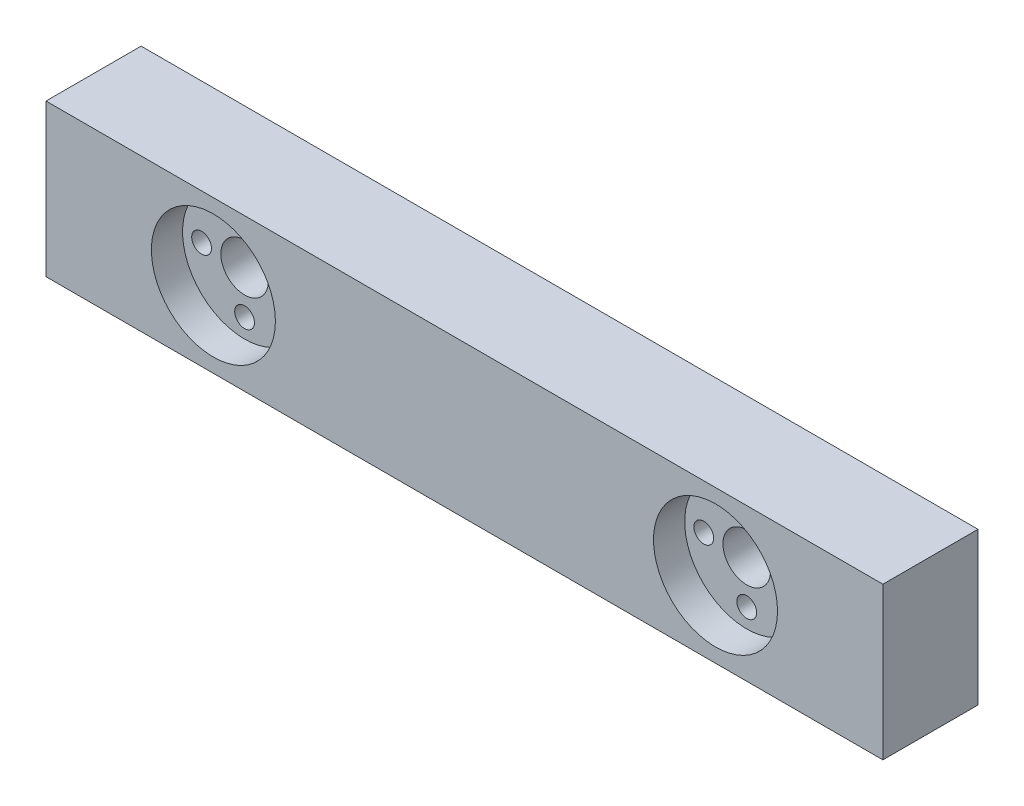
ISO-10303-21;
HEADER;
FILE_DESCRIPTION(('STEP AP214'),'2;1');
FILE_NAME('part.step','',(''),(''),'','','');
FILE_SCHEMA(('AUTOMOTIVE_DESIGN { 1 0 10303 214 1 1 1 1 }'));
ENDSEC;
DATA;
#1=APPLICATION_CONTEXT('core data for automotive mechanical design processes');
#2=APPLICATION_PROTOCOL_DEFINITION('international standard','automotive_design',2000,#1);
#3=PRODUCT_CONTEXT('',#1,'mechanical');
#4=PRODUCT('Part','Part','',(#3));
#5=PRODUCT_RELATED_PRODUCT_CATEGORY('part','',(#4));
#6=PRODUCT_DEFINITION_FORMATION('','',#4);
#7=PRODUCT_DEFINITION_CONTEXT('part definition',#1,'design');
#8=PRODUCT_DEFINITION('design','',#6,#7);
#9=PRODUCT_DEFINITION_SHAPE('','',#8);
#10=(LENGTH_UNIT() NAMED_UNIT(*) SI_UNIT(.MILLI.,.METRE.));
#11=(NAMED_UNIT(*) PLANE_ANGLE_UNIT() SI_UNIT($,.RADIAN.));
#12=(NAMED_UNIT(*) SI_UNIT($,.STERADIAN.) SOLID_ANGLE_UNIT());
#13=UNCERTAINTY_MEASURE_WITH_UNIT(LENGTH_MEASURE(1.E-05),#10,'distance_accuracy_value','');
#14=(GEOMETRIC_REPRESENTATION_CONTEXT(3) GLOBAL_UNCERTAINTY_ASSIGNED_CONTEXT((#13)) GLOBAL_UNIT_ASSIGNED_CONTEXT((#10,
#11,#12)) REPRESENTATION_CONTEXT('',''));
#15=CARTESIAN_POINT('',(0.,0.,0.));
#16=DIRECTION('',(0.,0.,1.));
#17=DIRECTION('',(1.,0.,0.));
#18=AXIS2_PLACEMENT_3D('',#15,#16,#17);
#19=CARTESIAN_POINT('',(5362.5,975.,-661.75019529546));
#20=DIRECTION('',(-1.,0.,0.));
#21=DIRECTION('',(0.,0.,1.));
#22=AXIS2_PLACEMENT_3D('',#19,#20,#21);
#23=PLANE('',#22);
#24=DIRECTION('',(0.,-1.,0.));
#25=VECTOR('',#24,1.);
#26=CARTESIAN_POINT('',(5362.5,975.,-630.50019529546));
#27=LINE('',#26,#25);
#28=CARTESIAN_POINT('',(5362.5,1025.,-630.50019529546));
#29=VERTEX_POINT('',#28);
#30=CARTESIAN_POINT('',(5362.5,975.,-630.50019529546));
#31=VERTEX_POINT('',#30);
#32=EDGE_CURVE('E118',#29,#31,#27,.T.);
#33=ORIENTED_EDGE('',*,*,#32,.F.);
#34=DIRECTION('',(0.,0.,1.));
#35=VECTOR('',#34,1.);
#36=CARTESIAN_POINT('',(5362.5,1025.,-661.75019529546));
#37=LINE('',#36,#35);
#38=CARTESIAN_POINT('',(5362.5,1025.,-661.75019529546));
#39=VERTEX_POINT('',#38);
#40=EDGE_CURVE('E11',#39,#29,#37,.T.);
#41=ORIENTED_EDGE('',*,*,#40,.F.);
#42=DIRECTION('',(0.,-1.,0.));
#43=VECTOR('',#42,1.);
#44=CARTESIAN_POINT('',(5362.5,975.,-661.75019529546));
#45=LINE('',#44,#43);
#46=CARTESIAN_POINT('',(5362.5,975.,-661.75019529546));
#47=VERTEX_POINT('',#46);
#48=EDGE_CURVE('E109',#39,#47,#45,.T.);
#49=ORIENTED_EDGE('',*,*,#48,.T.);
#50=DIRECTION('',(0.,0.,1.));
#51=VECTOR('',#50,1.);
#52=CARTESIAN_POINT('',(5362.5,975.,-661.75019529546));
#53=LINE('',#52,#51);
#54=EDGE_CURVE('E89',#47,#31,#53,.T.);
#55=ORIENTED_EDGE('',*,*,#54,.T.);
#56=EDGE_LOOP('',(#33,#41,#49,#55));
#57=FACE_BOUND('',#56,.T.);
#58=ADVANCED_FACE('F45',(#57),#23,.T.);
#59=CARTESIAN_POINT('',(5362.5,1025.,-661.75019529546));
#60=DIRECTION('',(0.,1.,0.));
#61=DIRECTION('',(0.,0.,1.));
#62=AXIS2_PLACEMENT_3D('',#59,#60,#61);
#63=PLANE('',#62);
#64=DIRECTION('',(-1.,0.,0.));
#65=VECTOR('',#64,1.);
#66=CARTESIAN_POINT('',(5362.5,1025.,-630.50019529546));
#67=LINE('',#66,#65);
#68=CARTESIAN_POINT('',(5637.5,1025.,-630.50019529546));
#69=VERTEX_POINT('',#68);
#70=EDGE_CURVE('E112',#69,#29,#67,.T.);
#71=ORIENTED_EDGE('',*,*,#70,.F.);
#72=DIRECTION('',(0.,0.,1.));
#73=VECTOR('',#72,1.);
#74=CARTESIAN_POINT('',(5637.5,1025.,-661.75019529546));
#75=LINE('',#74,#73);
#76=CARTESIAN_POINT('',(5637.5,1025.,-661.75019529546));
#77=VERTEX_POINT('',#76);
#78=EDGE_CURVE('E55',#77,#69,#75,.T.);
#79=ORIENTED_EDGE('',*,*,#78,.F.);
#80=DIRECTION('',(-1.,0.,0.));
#81=VECTOR('',#80,1.);
#82=CARTESIAN_POINT('',(5362.5,1025.,-661.75019529546));
#83=LINE('',#82,#81);
#84=EDGE_CURVE('E104',#77,#39,#83,.T.);
#85=ORIENTED_EDGE('',*,*,#84,.T.);
#86=ORIENTED_EDGE('',*,*,#40,.T.);
#87=EDGE_LOOP('',(#71,#79,#85,#86));
#88=FACE_BOUND('',#87,.T.);
#89=ADVANCED_FACE('F226',(#88),#63,.T.);
#90=CARTESIAN_POINT('',(5637.5,975.,-661.75019529546));
#91=DIRECTION('',(1.,0.,0.));
#92=DIRECTION('',(0.,0.,-1.));
#93=AXIS2_PLACEMENT_3D('',#90,#91,#92);
#94=PLANE('',#93);
#95=DIRECTION('',(0.,1.,0.));
#96=VECTOR('',#95,1.);
#97=CARTESIAN_POINT('',(5637.5,975.,-630.50019529546));
#98=LINE('',#97,#96);
#99=CARTESIAN_POINT('',(5637.5,975.,-630.50019529546));
#100=VERTEX_POINT('',#99);
#101=EDGE_CURVE('E97',#100,#69,#98,.T.);
#102=ORIENTED_EDGE('',*,*,#101,.F.);
#103=DIRECTION('',(0.,0.,1.));
#104=VECTOR('',#103,1.);
#105=CARTESIAN_POINT('',(5637.5,975.,-661.75019529546));
#106=LINE('',#105,#104);
#107=CARTESIAN_POINT('',(5637.5,975.,-661.75019529546));
#108=VERTEX_POINT('',#107);
#109=EDGE_CURVE('E92',#108,#100,#106,.T.);
#110=ORIENTED_EDGE('',*,*,#109,.F.);
#111=DIRECTION('',(0.,1.,0.));
#112=VECTOR('',#111,1.);
#113=CARTESIAN_POINT('',(5637.5,975.,-661.75019529546));
#114=LINE('',#113,#112);
#115=EDGE_CURVE('E95',#108,#77,#114,.T.);
#116=ORIENTED_EDGE('',*,*,#115,.T.);
#117=ORIENTED_EDGE('',*,*,#78,.T.);
#118=EDGE_LOOP('',(#102,#110,#116,#117));
#119=FACE_BOUND('',#118,.T.);
#120=ADVANCED_FACE('F94',(#119),#94,.T.);
#121=CARTESIAN_POINT('',(5362.5,975.,-661.75019529546));
#122=DIRECTION('',(0.,-1.,0.));
#123=DIRECTION('',(0.,0.,-1.));
#124=AXIS2_PLACEMENT_3D('',#121,#122,#123);
#125=PLANE('',#124);
#126=DIRECTION('',(1.,0.,0.));
#127=VECTOR('',#126,1.);
#128=CARTESIAN_POINT('',(5362.5,975.,-630.50019529546));
#129=LINE('',#128,#127);
#130=EDGE_CURVE('E122',#31,#100,#129,.T.);
#131=ORIENTED_EDGE('',*,*,#130,.F.);
#132=ORIENTED_EDGE('',*,*,#54,.F.);
#133=DIRECTION('',(1.,0.,0.));
#134=VECTOR('',#133,1.);
#135=CARTESIAN_POINT('',(5362.5,975.,-661.75019529546));
#136=LINE('',#135,#134);
#137=EDGE_CURVE('E103',#47,#108,#136,.T.);
#138=ORIENTED_EDGE('',*,*,#137,.T.);
#139=ORIENTED_EDGE('',*,*,#109,.T.);
#140=EDGE_LOOP('',(#131,#132,#138,#139));
#141=FACE_BOUND('',#140,.T.);
#142=ADVANCED_FACE('F107',(#141),#125,.T.);
#143=CARTESIAN_POINT('',(5362.5,975.,-661.75019529546));
#144=DIRECTION('',(0.,0.,-1.));
#145=DIRECTION('',(-1.,0.,0.));
#146=AXIS2_PLACEMENT_3D('',#143,#144,#145);
#147=PLANE('',#146);
#148=CARTESIAN_POINT('',(5582.5,985.875,-661.75019529546));
#149=DIRECTION('',(0.,0.,1.));
#150=DIRECTION('',(1.,0.,0.));
#151=AXIS2_PLACEMENT_3D('',#148,#149,#150);
#152=CIRCLE('',#151,3.25000000000004);
#153=CARTESIAN_POINT('',(5585.75,985.875,-661.75019529546));
#154=VERTEX_POINT('',#153);
#155=EDGE_CURVE('E168',#154,#154,#152,.T.);
#156=ORIENTED_EDGE('',*,*,#155,.T.);
#157=EDGE_LOOP('',(#156));
#158=FACE_BOUND('',#157,.T.);
#159=CARTESIAN_POINT('',(5568.375,1000.,-661.75019529546));
#160=DIRECTION('',(0.,0.,1.));
#161=DIRECTION('',(1.,0.,0.));
#162=AXIS2_PLACEMENT_3D('',#159,#160,#161);
#163=CIRCLE('',#162,3.25000000000004);
#164=CARTESIAN_POINT('',(5571.625,1000.,-661.75019529546));
#165=VERTEX_POINT('',#164);
#166=EDGE_CURVE('E298',#165,#165,#163,.T.);
#167=ORIENTED_EDGE('',*,*,#166,.T.);
#168=EDGE_LOOP('',(#167));
#169=FACE_BOUND('',#168,.T.);
#170=CARTESIAN_POINT('',(5582.5,1014.125,-661.75019529546));
#171=DIRECTION('',(0.,0.,1.));
#172=DIRECTION('',(1.,0.,0.));
#173=AXIS2_PLACEMENT_3D('',#170,#171,#172);
#174=CIRCLE('',#173,3.25000000000004);
#175=CARTESIAN_POINT('',(5585.75,1014.125,-661.75019529546));
#176=VERTEX_POINT('',#175);
#177=EDGE_CURVE('E302',#176,#176,#174,.T.);
#178=ORIENTED_EDGE('',*,*,#177,.T.);
#179=EDGE_LOOP('',(#178));
#180=FACE_BOUND('',#179,.T.);
#181=CARTESIAN_POINT('',(5596.625,1000.,-661.75019529546));
#182=DIRECTION('',(0.,0.,1.));
#183=DIRECTION('',(1.,0.,0.));
#184=AXIS2_PLACEMENT_3D('',#181,#182,#183);
#185=CIRCLE('',#184,3.25000000000003);
#186=CARTESIAN_POINT('',(5599.875,1000.,-661.75019529546));
#187=VERTEX_POINT('',#186);
#188=EDGE_CURVE('E308',#187,#187,#185,.T.);
#189=ORIENTED_EDGE('',*,*,#188,.T.);
#190=EDGE_LOOP('',(#189));
#191=FACE_BOUND('',#190,.T.);
#192=CARTESIAN_POINT('',(5417.5,985.875,-661.75019529546));
#193=DIRECTION('',(0.,0.,1.));
#194=DIRECTION('',(1.,0.,0.));
#195=AXIS2_PLACEMENT_3D('',#192,#193,#194);
#196=CIRCLE('',#195,3.25);
#197=CARTESIAN_POINT('',(5420.75,985.875,-661.75019529546));
#198=VERTEX_POINT('',#197);
#199=EDGE_CURVE('E150',#198,#198,#196,.T.);
#200=ORIENTED_EDGE('',*,*,#199,.T.);
#201=EDGE_LOOP('',(#200));
#202=FACE_BOUND('',#201,.T.);
#203=CARTESIAN_POINT('',(5403.375,1000.,-661.75019529546));
#204=DIRECTION('',(0.,0.,1.));
#205=DIRECTION('',(1.,0.,0.));
#206=AXIS2_PLACEMENT_3D('',#203,#204,#205);
#207=CIRCLE('',#206,3.25);
#208=CARTESIAN_POINT('',(5406.625,1000.,-661.75019529546));
#209=VERTEX_POINT('',#208);
#210=EDGE_CURVE('E189',#209,#209,#207,.T.);
#211=ORIENTED_EDGE('',*,*,#210,.T.);
#212=EDGE_LOOP('',(#211));
#213=FACE_BOUND('',#212,.T.);
#214=CARTESIAN_POINT('',(5417.5,1014.125,-661.75019529546));
#215=DIRECTION('',(0.,0.,1.));
#216=DIRECTION('',(1.,0.,0.));
#217=AXIS2_PLACEMENT_3D('',#214,#215,#216);
#218=CIRCLE('',#217,3.24999999999999);
#219=CARTESIAN_POINT('',(5420.75,1014.125,-661.75019529546));
#220=VERTEX_POINT('',#219);
#221=EDGE_CURVE('E183',#220,#220,#218,.T.);
#222=ORIENTED_EDGE('',*,*,#221,.T.);
#223=EDGE_LOOP('',(#222));
#224=FACE_BOUND('',#223,.T.);
#225=CARTESIAN_POINT('',(5431.625,1000.,-661.75019529546));
#226=DIRECTION('',(0.,0.,1.));
#227=DIRECTION('',(1.,0.,0.));
#228=AXIS2_PLACEMENT_3D('',#225,#226,#227);
#229=CIRCLE('',#228,3.25);
#230=CARTESIAN_POINT('',(5434.875,1000.,-661.75019529546));
#231=VERTEX_POINT('',#230);
#232=EDGE_CURVE('E178',#231,#231,#229,.T.);
#233=ORIENTED_EDGE('',*,*,#232,.T.);
#234=EDGE_LOOP('',(#233));
#235=FACE_BOUND('',#234,.T.);
#236=CARTESIAN_POINT('',(5417.5,1000.,-661.75019529546));
#237=DIRECTION('',(0.,0.,1.));
#238=DIRECTION('',(1.,0.,0.));
#239=AXIS2_PLACEMENT_3D('',#236,#237,#238);
#240=CIRCLE('',#239,7.8125);
#241=CARTESIAN_POINT('',(5425.3125,1000.,-661.75019529546));
#242=VERTEX_POINT('',#241);
#243=EDGE_CURVE('E140',#242,#242,#240,.T.);
#244=ORIENTED_EDGE('',*,*,#243,.T.);
#245=EDGE_LOOP('',(#244));
#246=FACE_BOUND('',#245,.T.);
#247=CARTESIAN_POINT('',(5582.5,1000.,-661.75019529546));
#248=DIRECTION('',(0.,0.,1.));
#249=DIRECTION('',(1.,0.,0.));
#250=AXIS2_PLACEMENT_3D('',#247,#248,#249);
#251=CIRCLE('',#250,7.81250000000002);
#252=CARTESIAN_POINT('',(5590.3125,1000.,-661.75019529546));
#253=VERTEX_POINT('',#252);
#254=EDGE_CURVE('E162',#253,#253,#251,.T.);
#255=ORIENTED_EDGE('',*,*,#254,.T.);
#256=EDGE_LOOP('',(#255));
#257=FACE_BOUND('',#256,.T.);
#258=ORIENTED_EDGE('',*,*,#48,.F.);
#259=ORIENTED_EDGE('',*,*,#84,.F.);
#260=ORIENTED_EDGE('',*,*,#115,.F.);
#261=ORIENTED_EDGE('',*,*,#137,.F.);
#262=EDGE_LOOP('',(#258,#259,#260,#261));
#263=FACE_BOUND('',#262,.T.);
#264=ADVANCED_FACE('F102',(#158,#169,#180,#191,#202,#213,#224,#235,#246,#257,#263),#147,.T.);
#265=CARTESIAN_POINT('',(5362.5,975.,-630.50019529546));
#266=DIRECTION('',(0.,0.,-1.));
#267=DIRECTION('',(-1.,0.,0.));
#268=AXIS2_PLACEMENT_3D('',#265,#266,#267);
#269=PLANE('',#268);
#270=CARTESIAN_POINT('',(5417.5,1000.,-630.50019529546));
#271=DIRECTION('',(0.,0.,1.));
#272=DIRECTION('',(1.,0.,0.));
#273=AXIS2_PLACEMENT_3D('',#270,#271,#272);
#274=CIRCLE('',#273,20.375);
#275=CARTESIAN_POINT('',(5437.875,1000.,-630.50019529546));
#276=VERTEX_POINT('',#275);
#277=EDGE_CURVE('E202',#276,#276,#274,.T.);
#278=ORIENTED_EDGE('',*,*,#277,.F.);
#279=EDGE_LOOP('',(#278));
#280=FACE_BOUND('',#279,.T.);
#281=CARTESIAN_POINT('',(5582.5,1000.,-630.50019529546));
#282=DIRECTION('',(0.,0.,1.));
#283=DIRECTION('',(1.,0.,0.));
#284=AXIS2_PLACEMENT_3D('',#281,#282,#283);
#285=CIRCLE('',#284,20.375);
#286=CARTESIAN_POINT('',(5602.875,1000.,-630.50019529546));
#287=VERTEX_POINT('',#286);
#288=EDGE_CURVE('E206',#287,#287,#285,.T.);
#289=ORIENTED_EDGE('',*,*,#288,.F.);
#290=EDGE_LOOP('',(#289));
#291=FACE_BOUND('',#290,.T.);
#292=ORIENTED_EDGE('',*,*,#32,.T.);
#293=ORIENTED_EDGE('',*,*,#130,.T.);
#294=ORIENTED_EDGE('',*,*,#101,.T.);
#295=ORIENTED_EDGE('',*,*,#70,.T.);
#296=EDGE_LOOP('',(#292,#293,#294,#295));
#297=FACE_BOUND('',#296,.T.);
#298=ADVANCED_FACE('F218',(#280,#291,#297),#269,.F.);
#299=CARTESIAN_POINT('',(5582.5,1000.,-640.75019529546));
#300=DIRECTION('',(0.,0.,1.));
#301=DIRECTION('',(1.,0.,0.));
#302=AXIS2_PLACEMENT_3D('',#299,#300,#301);
#303=CYLINDRICAL_SURFACE('',#302,20.375);
#304=CARTESIAN_POINT('',(5582.5,1000.,-640.75019529546));
#305=DIRECTION('',(0.,0.,1.));
#306=DIRECTION('',(1.,0.,0.));
#307=AXIS2_PLACEMENT_3D('',#304,#305,#306);
#308=CIRCLE('',#307,20.375);
#309=CARTESIAN_POINT('',(5602.875,1000.,-640.75019529546));
#310=VERTEX_POINT('',#309);
#311=EDGE_CURVE('E144',#310,#310,#308,.T.);
#312=CARTESIAN_POINT('',(5602.875,1000.,-640.75019529546));
#313=CARTESIAN_POINT('',(5602.875,1000.,-640.643424462127));
#314=CARTESIAN_POINT('',(5602.875,1000.,-640.536653628794));
#315=CARTESIAN_POINT('',(5602.875,1000.,-640.323111962127));
#316=CARTESIAN_POINT('',(5602.875,1000.,-640.216341128794));
#317=CARTESIAN_POINT('',(5602.875,1000.,-640.002799462127));
#318=CARTESIAN_POINT('',(5602.875,1000.,-639.896028628794));
#319=CARTESIAN_POINT('',(5602.875,1000.,-639.682486962127));
#320=CARTESIAN_POINT('',(5602.875,1000.,-639.575716128794));
#321=CARTESIAN_POINT('',(5602.875,1000.,-639.362174462127));
#322=CARTESIAN_POINT('',(5602.875,1000.,-639.255403628794));
#323=CARTESIAN_POINT('',(5602.875,1000.,-639.041861962127));
#324=CARTESIAN_POINT('',(5602.875,1000.,-638.935091128794));
#325=CARTESIAN_POINT('',(5602.875,1000.,-638.721549462127));
#326=CARTESIAN_POINT('',(5602.875,1000.,-638.614778628794));
#327=CARTESIAN_POINT('',(5602.875,1000.,-638.401236962127));
#328=CARTESIAN_POINT('',(5602.875,1000.,-638.294466128794));
#329=CARTESIAN_POINT('',(5602.875,1000.,-638.080924462127));
#330=CARTESIAN_POINT('',(5602.875,1000.,-637.974153628794));
#331=CARTESIAN_POINT('',(5602.875,1000.,-637.760611962127));
#332=CARTESIAN_POINT('',(5602.875,1000.,-637.653841128794));
#333=CARTESIAN_POINT('',(5602.875,1000.,-637.440299462127));
#334=CARTESIAN_POINT('',(5602.875,1000.,-637.333528628794));
#335=CARTESIAN_POINT('',(5602.875,1000.,-637.119986962127));
#336=CARTESIAN_POINT('',(5602.875,1000.,-637.013216128794));
#337=CARTESIAN_POINT('',(5602.875,1000.,-636.799674462127));
#338=CARTESIAN_POINT('',(5602.875,1000.,-636.692903628794));
#339=CARTESIAN_POINT('',(5602.875,1000.,-636.479361962127));
#340=CARTESIAN_POINT('',(5602.875,1000.,-636.372591128794));
#341=CARTESIAN_POINT('',(5602.875,1000.,-636.159049462127));
#342=CARTESIAN_POINT('',(5602.875,1000.,-636.052278628794));
#343=CARTESIAN_POINT('',(5602.875,1000.,-635.838736962127));
#344=CARTESIAN_POINT('',(5602.875,1000.,-635.731966128794));
#345=CARTESIAN_POINT('',(5602.875,1000.,-635.518424462127));
#346=CARTESIAN_POINT('',(5602.875,1000.,-635.411653628794));
#347=CARTESIAN_POINT('',(5602.875,1000.,-635.198111962127));
#348=CARTESIAN_POINT('',(5602.875,1000.,-635.091341128794));
#349=CARTESIAN_POINT('',(5602.875,1000.,-634.877799462127));
#350=CARTESIAN_POINT('',(5602.875,1000.,-634.771028628794));
#351=CARTESIAN_POINT('',(5602.875,1000.,-634.557486962127));
#352=CARTESIAN_POINT('',(5602.875,1000.,-634.450716128794));
#353=CARTESIAN_POINT('',(5602.875,1000.,-634.237174462127));
#354=CARTESIAN_POINT('',(5602.875,1000.,-634.130403628794));
#355=CARTESIAN_POINT('',(5602.875,1000.,-633.916861962127));
#356=CARTESIAN_POINT('',(5602.875,1000.,-633.810091128794));
#357=CARTESIAN_POINT('',(5602.875,1000.,-633.596549462127));
#358=CARTESIAN_POINT('',(5602.875,1000.,-633.489778628794));
#359=CARTESIAN_POINT('',(5602.875,1000.,-633.276236962127));
#360=CARTESIAN_POINT('',(5602.875,1000.,-633.169466128794));
#361=CARTESIAN_POINT('',(5602.875,1000.,-632.955924462127));
#362=CARTESIAN_POINT('',(5602.875,1000.,-632.849153628794));
#363=CARTESIAN_POINT('',(5602.875,1000.,-632.635611962127));
#364=CARTESIAN_POINT('',(5602.875,1000.,-632.528841128794));
#365=CARTESIAN_POINT('',(5602.875,1000.,-632.315299462127));
#366=CARTESIAN_POINT('',(5602.875,1000.,-632.208528628794));
#367=CARTESIAN_POINT('',(5602.875,1000.,-631.994986962127));
#368=CARTESIAN_POINT('',(5602.875,1000.,-631.888216128794));
#369=CARTESIAN_POINT('',(5602.875,1000.,-631.674674462127));
#370=CARTESIAN_POINT('',(5602.875,1000.,-631.567903628794));
#371=CARTESIAN_POINT('',(5602.875,1000.,-631.354361962127));
#372=CARTESIAN_POINT('',(5602.875,1000.,-631.247591128794));
#373=CARTESIAN_POINT('',(5602.875,1000.,-631.034049462127));
#374=CARTESIAN_POINT('',(5602.875,1000.,-630.927278628794));
#375=CARTESIAN_POINT('',(5602.875,1000.,-630.713736962127));
#376=CARTESIAN_POINT('',(5602.875,1000.,-630.606966128794));
#377=CARTESIAN_POINT('',(5602.875,1000.,-630.50019529546));
#378=B_SPLINE_CURVE_WITH_KNOTS('',3,(#312,#313,#314,#315,#316,#317,#318,#319,#320,#321,#322,
#323,#324,#325,#326,#327,#328,#329,#330,#331,#332,#333,#334,#335,#336,#337,#338,#339,#340,#341,
#342,#343,#344,#345,#346,#347,#348,#349,#350,#351,#352,#353,#354,#355,#356,#357,#358,#359,#360,
#361,#362,#363,#364,#365,#366,#367,#368,#369,#370,#371,#372,#373,#374,#375,#376,#377),
.UNSPECIFIED.,.F.,.F.,(4,2,2,2,2,2,2,2,2,2,2,2,2,2,2,2,2,2,2,2,2,2,2,2,2,2,2,2,2,2,2,2,4),(0.,
0.320312500000086,0.640625000000061,0.960937500000036,1.28125000000001,1.6015625000001,
1.92187500000007,2.24218750000005,2.56250000000002,2.8828125,3.20312500000008,3.52343750000006,
3.84375000000003,4.16406250000001,4.4843750000001,4.80468750000007,5.12500000000005,
5.44531250000002,5.765625,6.08593750000008,6.40625000000006,6.72656250000003,7.04687500000001,
7.36718750000009,7.68750000000007,8.00781250000004,8.32812500000002,8.64843749999999,
8.96875000000008,9.28906250000006,9.60937500000003,9.92968750000001,10.2500000000001),.UNSPECIFIED.);
#379=EDGE_CURVE('BSEAM215',#310,#287,#378,.T.);
#380=ORIENTED_EDGE('',*,*,#311,.F.);
#381=ORIENTED_EDGE('',*,*,#288,.T.);
#382=ORIENTED_EDGE('',*,*,#379,.T.);
#383=ORIENTED_EDGE('',*,*,#379,.F.);
#384=EDGE_LOOP('',(#380,#382,#381,#383));
#385=FACE_BOUND('',#384,.T.);
#386=ADVANCED_FACE('F215',(#385),#303,.F.);
#387=CARTESIAN_POINT('',(5582.5,1000.,-640.75019529546));
#388=DIRECTION('',(0.,0.,1.));
#389=DIRECTION('',(1.,0.,0.));
#390=AXIS2_PLACEMENT_3D('',#387,#388,#389);
#391=PLANE('',#390);
#392=CARTESIAN_POINT('',(5582.5,985.875,-640.75019529546));
#393=DIRECTION('',(0.,0.,1.));
#394=DIRECTION('',(1.,0.,0.));
#395=AXIS2_PLACEMENT_3D('',#392,#393,#394);
#396=CIRCLE('',#395,3.25000000000004);
#397=CARTESIAN_POINT('',(5585.75,985.875,-640.75019529546));
#398=VERTEX_POINT('',#397);
#399=EDGE_CURVE('E48',#398,#398,#396,.T.);
#400=ORIENTED_EDGE('',*,*,#399,.F.);
#401=EDGE_LOOP('',(#400));
#402=FACE_BOUND('',#401,.T.);
#403=CARTESIAN_POINT('',(5568.375,1000.,-640.75019529546));
#404=DIRECTION('',(0.,0.,1.));
#405=DIRECTION('',(1.,0.,0.));
#406=AXIS2_PLACEMENT_3D('',#403,#404,#405);
#407=CIRCLE('',#406,3.25000000000004);
#408=CARTESIAN_POINT('',(5571.625,1000.,-640.75019529546));
#409=VERTEX_POINT('',#408);
#410=EDGE_CURVE('E171',#409,#409,#407,.T.);
#411=ORIENTED_EDGE('',*,*,#410,.F.);
#412=EDGE_LOOP('',(#411));
#413=FACE_BOUND('',#412,.T.);
#414=CARTESIAN_POINT('',(5582.5,1014.125,-640.75019529546));
#415=DIRECTION('',(0.,0.,1.));
#416=DIRECTION('',(1.,0.,0.));
#417=AXIS2_PLACEMENT_3D('',#414,#415,#416);
#418=CIRCLE('',#417,3.25000000000004);
#419=CARTESIAN_POINT('',(5585.75,1014.125,-640.75019529546));
#420=VERTEX_POINT('',#419);
#421=EDGE_CURVE('E167',#420,#420,#418,.T.);
#422=ORIENTED_EDGE('',*,*,#421,.F.);
#423=EDGE_LOOP('',(#422));
#424=FACE_BOUND('',#423,.T.);
#425=CARTESIAN_POINT('',(5596.625,1000.,-640.75019529546));
#426=DIRECTION('',(0.,0.,1.));
#427=DIRECTION('',(1.,0.,0.));
#428=AXIS2_PLACEMENT_3D('',#425,#426,#427);
#429=CIRCLE('',#428,3.25000000000003);
#430=CARTESIAN_POINT('',(5599.875,1000.,-640.75019529546));
#431=VERTEX_POINT('',#430);
#432=EDGE_CURVE('E163',#431,#431,#429,.T.);
#433=ORIENTED_EDGE('',*,*,#432,.F.);
#434=EDGE_LOOP('',(#433));
#435=FACE_BOUND('',#434,.T.);
#436=CARTESIAN_POINT('',(5582.5,1000.,-640.75019529546));
#437=DIRECTION('',(0.,0.,1.));
#438=DIRECTION('',(1.,0.,0.));
#439=AXIS2_PLACEMENT_3D('',#436,#437,#438);
#440=CIRCLE('',#439,7.81250000000002);
#441=CARTESIAN_POINT('',(5590.3125,1000.,-640.75019529546));
#442=VERTEX_POINT('',#441);
#443=EDGE_CURVE('E139',#442,#442,#440,.T.);
#444=ORIENTED_EDGE('',*,*,#443,.F.);
#445=EDGE_LOOP('',(#444));
#446=FACE_BOUND('',#445,.T.);
#447=ORIENTED_EDGE('',*,*,#311,.T.);
#448=EDGE_LOOP('',(#447));
#449=FACE_BOUND('',#448,.T.);
#450=ADVANCED_FACE('F213',(#402,#413,#424,#435,#446,#449),#391,.T.);
#451=CARTESIAN_POINT('',(5417.5,1000.,-640.75019529546));
#452=DIRECTION('',(0.,0.,1.));
#453=DIRECTION('',(1.,0.,0.));
#454=AXIS2_PLACEMENT_3D('',#451,#452,#453);
#455=CYLINDRICAL_SURFACE('',#454,20.375);
#456=CARTESIAN_POINT('',(5417.5,1000.,-640.75019529546));
#457=DIRECTION('',(0.,0.,1.));
#458=DIRECTION('',(1.,0.,0.));
#459=AXIS2_PLACEMENT_3D('',#456,#457,#458);
#460=CIRCLE('',#459,20.375);
#461=CARTESIAN_POINT('',(5437.875,1000.,-640.75019529546));
#462=VERTEX_POINT('',#461);
#463=EDGE_CURVE('E123',#462,#462,#460,.T.);
#464=CARTESIAN_POINT('',(5437.875,1000.,-640.75019529546));
#465=CARTESIAN_POINT('',(5437.875,1000.,-640.643424462127));
#466=CARTESIAN_POINT('',(5437.875,1000.,-640.536653628794));
#467=CARTESIAN_POINT('',(5437.875,1000.,-640.323111962127));
#468=CARTESIAN_POINT('',(5437.875,1000.,-640.216341128794));
#469=CARTESIAN_POINT('',(5437.875,1000.,-640.002799462127));
#470=CARTESIAN_POINT('',(5437.875,1000.,-639.896028628794));
#471=CARTESIAN_POINT('',(5437.875,1000.,-639.682486962127));
#472=CARTESIAN_POINT('',(5437.875,1000.,-639.575716128794));
#473=CARTESIAN_POINT('',(5437.875,1000.,-639.362174462127));
#474=CARTESIAN_POINT('',(5437.875,1000.,-639.255403628794));
#475=CARTESIAN_POINT('',(5437.875,1000.,-639.041861962127));
#476=CARTESIAN_POINT('',(5437.875,1000.,-638.935091128794));
#477=CARTESIAN_POINT('',(5437.875,1000.,-638.721549462127));
#478=CARTESIAN_POINT('',(5437.875,1000.,-638.614778628794));
#479=CARTESIAN_POINT('',(5437.875,1000.,-638.401236962127));
#480=CARTESIAN_POINT('',(5437.875,1000.,-638.294466128794));
#481=CARTESIAN_POINT('',(5437.875,1000.,-638.080924462127));
#482=CARTESIAN_POINT('',(5437.875,1000.,-637.974153628794));
#483=CARTESIAN_POINT('',(5437.875,1000.,-637.760611962127));
#484=CARTESIAN_POINT('',(5437.875,1000.,-637.653841128794));
#485=CARTESIAN_POINT('',(5437.875,1000.,-637.440299462127));
#486=CARTESIAN_POINT('',(5437.875,1000.,-637.333528628794));
#487=CARTESIAN_POINT('',(5437.875,1000.,-637.119986962127));
#488=CARTESIAN_POINT('',(5437.875,1000.,-637.013216128794));
#489=CARTESIAN_POINT('',(5437.875,1000.,-636.799674462127));
#490=CARTESIAN_POINT('',(5437.875,1000.,-636.692903628794));
#491=CARTESIAN_POINT('',(5437.875,1000.,-636.479361962127));
#492=CARTESIAN_POINT('',(5437.875,1000.,-636.372591128794));
#493=CARTESIAN_POINT('',(5437.875,1000.,-636.159049462127));
#494=CARTESIAN_POINT('',(5437.875,1000.,-636.052278628794));
#495=CARTESIAN_POINT('',(5437.875,1000.,-635.838736962127));
#496=CARTESIAN_POINT('',(5437.875,1000.,-635.731966128794));
#497=CARTESIAN_POINT('',(5437.875,1000.,-635.518424462127));
#498=CARTESIAN_POINT('',(5437.875,1000.,-635.411653628794));
#499=CARTESIAN_POINT('',(5437.875,1000.,-635.198111962127));
#500=CARTESIAN_POINT('',(5437.875,1000.,-635.091341128794));
#501=CARTESIAN_POINT('',(5437.875,1000.,-634.877799462127));
#502=CARTESIAN_POINT('',(5437.875,1000.,-634.771028628794));
#503=CARTESIAN_POINT('',(5437.875,1000.,-634.557486962127));
#504=CARTESIAN_POINT('',(5437.875,1000.,-634.450716128794));
#505=CARTESIAN_POINT('',(5437.875,1000.,-634.237174462127));
#506=CARTESIAN_POINT('',(5437.875,1000.,-634.130403628794));
#507=CARTESIAN_POINT('',(5437.875,1000.,-633.916861962127));
#508=CARTESIAN_POINT('',(5437.875,1000.,-633.810091128794));
#509=CARTESIAN_POINT('',(5437.875,1000.,-633.596549462127));
#510=CARTESIAN_POINT('',(5437.875,1000.,-633.489778628794));
#511=CARTESIAN_POINT('',(5437.875,1000.,-633.276236962127));
#512=CARTESIAN_POINT('',(5437.875,1000.,-633.169466128794));
#513=CARTESIAN_POINT('',(5437.875,1000.,-632.955924462127));
#514=CARTESIAN_POINT('',(5437.875,1000.,-632.849153628794));
#515=CARTESIAN_POINT('',(5437.875,1000.,-632.635611962127));
#516=CARTESIAN_POINT('',(5437.875,1000.,-632.528841128794));
#517=CARTESIAN_POINT('',(5437.875,1000.,-632.315299462127));
#518=CARTESIAN_POINT('',(5437.875,1000.,-632.208528628794));
#519=CARTESIAN_POINT('',(5437.875,1000.,-631.994986962127));
#520=CARTESIAN_POINT('',(5437.875,1000.,-631.888216128794));
#521=CARTESIAN_POINT('',(5437.875,1000.,-631.674674462127));
#522=CARTESIAN_POINT('',(5437.875,1000.,-631.567903628794));
#523=CARTESIAN_POINT('',(5437.875,1000.,-631.354361962127));
#524=CARTESIAN_POINT('',(5437.875,1000.,-631.247591128794));
#525=CARTESIAN_POINT('',(5437.875,1000.,-631.034049462127));
#526=CARTESIAN_POINT('',(5437.875,1000.,-630.927278628794));
#527=CARTESIAN_POINT('',(5437.875,1000.,-630.713736962127));
#528=CARTESIAN_POINT('',(5437.875,1000.,-630.606966128794));
#529=CARTESIAN_POINT('',(5437.875,1000.,-630.50019529546));
#530=B_SPLINE_CURVE_WITH_KNOTS('',3,(#464,#465,#466,#467,#468,#469,#470,#471,#472,#473,#474,
#475,#476,#477,#478,#479,#480,#481,#482,#483,#484,#485,#486,#487,#488,#489,#490,#491,#492,#493,
#494,#495,#496,#497,#498,#499,#500,#501,#502,#503,#504,#505,#506,#507,#508,#509,#510,#511,#512,
#513,#514,#515,#516,#517,#518,#519,#520,#521,#522,#523,#524,#525,#526,#527,#528,#529),
.UNSPECIFIED.,.F.,.F.,(4,2,2,2,2,2,2,2,2,2,2,2,2,2,2,2,2,2,2,2,2,2,2,2,2,2,2,2,2,2,2,2,4),(0.,
0.320312500000086,0.640625000000061,0.960937500000036,1.28125000000001,1.6015625000001,
1.92187500000007,2.24218750000005,2.56250000000002,2.8828125,3.20312500000008,3.52343750000006,
3.84375000000003,4.16406250000001,4.4843750000001,4.80468750000007,5.12500000000005,
5.44531250000002,5.765625,6.08593750000008,6.40625000000006,6.72656250000003,7.04687500000001,
7.36718750000009,7.68750000000007,8.00781250000004,8.32812500000002,8.64843749999999,
8.96875000000008,9.28906250000006,9.60937500000003,9.92968750000001,10.2500000000001),.UNSPECIFIED.);
#531=EDGE_CURVE('BSEAM246',#462,#276,#530,.T.);
#532=ORIENTED_EDGE('',*,*,#463,.F.);
#533=ORIENTED_EDGE('',*,*,#277,.T.);
#534=ORIENTED_EDGE('',*,*,#531,.T.);
#535=ORIENTED_EDGE('',*,*,#531,.F.);
#536=EDGE_LOOP('',(#532,#534,#533,#535));
#537=FACE_BOUND('',#536,.T.);
#538=ADVANCED_FACE('F246',(#537),#455,.F.);
#539=CARTESIAN_POINT('',(5417.5,1000.,-640.75019529546));
#540=DIRECTION('',(0.,0.,1.));
#541=DIRECTION('',(1.,0.,0.));
#542=AXIS2_PLACEMENT_3D('',#539,#540,#541);
#543=PLANE('',#542);
#544=CARTESIAN_POINT('',(5417.5,985.875,-640.75019529546));
#545=DIRECTION('',(0.,0.,1.));
#546=DIRECTION('',(1.,0.,0.));
#547=AXIS2_PLACEMENT_3D('',#544,#545,#546);
#548=CIRCLE('',#547,3.25);
#549=CARTESIAN_POINT('',(5420.75,985.875,-640.75019529546));
#550=VERTEX_POINT('',#549);
#551=EDGE_CURVE('E158',#550,#550,#548,.T.);
#552=ORIENTED_EDGE('',*,*,#551,.F.);
#553=EDGE_LOOP('',(#552));
#554=FACE_BOUND('',#553,.T.);
#555=CARTESIAN_POINT('',(5403.375,1000.,-640.75019529546));
#556=DIRECTION('',(0.,0.,1.));
#557=DIRECTION('',(1.,0.,0.));
#558=AXIS2_PLACEMENT_3D('',#555,#556,#557);
#559=CIRCLE('',#558,3.25);
#560=CARTESIAN_POINT('',(5406.625,1000.,-640.75019529546));
#561=VERTEX_POINT('',#560);
#562=EDGE_CURVE('E154',#561,#561,#559,.T.);
#563=ORIENTED_EDGE('',*,*,#562,.F.);
#564=EDGE_LOOP('',(#563));
#565=FACE_BOUND('',#564,.T.);
#566=CARTESIAN_POINT('',(5417.5,1014.125,-640.75019529546));
#567=DIRECTION('',(0.,0.,1.));
#568=DIRECTION('',(1.,0.,0.));
#569=AXIS2_PLACEMENT_3D('',#566,#567,#568);
#570=CIRCLE('',#569,3.24999999999999);
#571=CARTESIAN_POINT('',(5420.75,1014.125,-640.75019529546));
#572=VERTEX_POINT('',#571);
#573=EDGE_CURVE('E149',#572,#572,#570,.T.);
#574=ORIENTED_EDGE('',*,*,#573,.F.);
#575=EDGE_LOOP('',(#574));
#576=FACE_BOUND('',#575,.T.);
#577=CARTESIAN_POINT('',(5431.625,1000.,-640.75019529546));
#578=DIRECTION('',(0.,0.,1.));
#579=DIRECTION('',(1.,0.,0.));
#580=AXIS2_PLACEMENT_3D('',#577,#578,#579);
#581=CIRCLE('',#580,3.25);
#582=CARTESIAN_POINT('',(5434.875,1000.,-640.75019529546));
#583=VERTEX_POINT('',#582);
#584=EDGE_CURVE('E145',#583,#583,#581,.T.);
#585=ORIENTED_EDGE('',*,*,#584,.F.);
#586=EDGE_LOOP('',(#585));
#587=FACE_BOUND('',#586,.T.);
#588=CARTESIAN_POINT('',(5417.5,1000.,-640.75019529546));
#589=DIRECTION('',(0.,0.,1.));
#590=DIRECTION('',(1.,0.,0.));
#591=AXIS2_PLACEMENT_3D('',#588,#589,#590);
#592=CIRCLE('',#591,7.8125);
#593=CARTESIAN_POINT('',(5425.3125,1000.,-640.75019529546));
#594=VERTEX_POINT('',#593);
#595=EDGE_CURVE('E135',#594,#594,#592,.T.);
#596=ORIENTED_EDGE('',*,*,#595,.F.);
#597=EDGE_LOOP('',(#596));
#598=FACE_BOUND('',#597,.T.);
#599=ORIENTED_EDGE('',*,*,#463,.T.);
#600=EDGE_LOOP('',(#599));
#601=FACE_BOUND('',#600,.T.);
#602=ADVANCED_FACE('F251',(#554,#565,#576,#587,#598,#601),#543,.T.);
#603=CARTESIAN_POINT('',(5417.5,1000.,-661.75019529546));
#604=DIRECTION('',(0.,0.,1.));
#605=DIRECTION('',(1.,0.,0.));
#606=AXIS2_PLACEMENT_3D('',#603,#604,#605);
#607=CYLINDRICAL_SURFACE('',#606,7.8125);
#608=ORIENTED_EDGE('',*,*,#595,.T.);
#609=EDGE_LOOP('',(#608));
#610=FACE_BOUND('',#609,.T.);
#611=ORIENTED_EDGE('',*,*,#243,.F.);
#612=EDGE_LOOP('',(#611));
#613=FACE_BOUND('',#612,.T.);
#614=ADVANCED_FACE('F255',(#610,#613),#607,.F.);
#615=CARTESIAN_POINT('',(5582.5,1000.,-661.75019529546));
#616=DIRECTION('',(0.,0.,1.));
#617=DIRECTION('',(1.,0.,0.));
#618=AXIS2_PLACEMENT_3D('',#615,#616,#617);
#619=CYLINDRICAL_SURFACE('',#618,7.81250000000002);
#620=ORIENTED_EDGE('',*,*,#443,.T.);
#621=EDGE_LOOP('',(#620));
#622=FACE_BOUND('',#621,.T.);
#623=ORIENTED_EDGE('',*,*,#254,.F.);
#624=EDGE_LOOP('',(#623));
#625=FACE_BOUND('',#624,.T.);
#626=ADVANCED_FACE('F257',(#622,#625),#619,.F.);
#627=CARTESIAN_POINT('',(5431.625,1000.,-661.75019529546));
#628=DIRECTION('',(0.,0.,1.));
#629=DIRECTION('',(1.,0.,0.));
#630=AXIS2_PLACEMENT_3D('',#627,#628,#629);
#631=CYLINDRICAL_SURFACE('',#630,3.25);
#632=ORIENTED_EDGE('',*,*,#584,.T.);
#633=EDGE_LOOP('',(#632));
#634=FACE_BOUND('',#633,.T.);
#635=ORIENTED_EDGE('',*,*,#232,.F.);
#636=EDGE_LOOP('',(#635));
#637=FACE_BOUND('',#636,.T.);
#638=ADVANCED_FACE('F260',(#634,#637),#631,.F.);
#639=CARTESIAN_POINT('',(5417.5,1014.125,-661.75019529546));
#640=DIRECTION('',(0.,0.,1.));
#641=DIRECTION('',(1.,0.,0.));
#642=AXIS2_PLACEMENT_3D('',#639,#640,#641);
#643=CYLINDRICAL_SURFACE('',#642,3.24999999999999);
#644=ORIENTED_EDGE('',*,*,#573,.T.);
#645=EDGE_LOOP('',(#644));
#646=FACE_BOUND('',#645,.T.);
#647=ORIENTED_EDGE('',*,*,#221,.F.);
#648=EDGE_LOOP('',(#647));
#649=FACE_BOUND('',#648,.T.);
#650=ADVANCED_FACE('F267',(#646,#649),#643,.F.);
#651=CARTESIAN_POINT('',(5403.375,1000.,-661.75019529546));
#652=DIRECTION('',(0.,0.,1.));
#653=DIRECTION('',(1.,0.,0.));
#654=AXIS2_PLACEMENT_3D('',#651,#652,#653);
#655=CYLINDRICAL_SURFACE('',#654,3.25);
#656=ORIENTED_EDGE('',*,*,#562,.T.);
#657=EDGE_LOOP('',(#656));
#658=FACE_BOUND('',#657,.T.);
#659=ORIENTED_EDGE('',*,*,#210,.F.);
#660=EDGE_LOOP('',(#659));
#661=FACE_BOUND('',#660,.T.);
#662=ADVANCED_FACE('F271',(#658,#661),#655,.F.);
#663=CARTESIAN_POINT('',(5417.5,985.875,-661.75019529546));
#664=DIRECTION('',(0.,0.,1.));
#665=DIRECTION('',(1.,0.,0.));
#666=AXIS2_PLACEMENT_3D('',#663,#664,#665);
#667=CYLINDRICAL_SURFACE('',#666,3.25);
#668=ORIENTED_EDGE('',*,*,#551,.T.);
#669=EDGE_LOOP('',(#668));
#670=FACE_BOUND('',#669,.T.);
#671=ORIENTED_EDGE('',*,*,#199,.F.);
#672=EDGE_LOOP('',(#671));
#673=FACE_BOUND('',#672,.T.);
#674=ADVANCED_FACE('F275',(#670,#673),#667,.F.);
#675=CARTESIAN_POINT('',(5596.625,1000.,-661.75019529546));
#676=DIRECTION('',(0.,0.,1.));
#677=DIRECTION('',(1.,0.,0.));
#678=AXIS2_PLACEMENT_3D('',#675,#676,#677);
#679=CYLINDRICAL_SURFACE('',#678,3.25000000000003);
#680=ORIENTED_EDGE('',*,*,#432,.T.);
#681=EDGE_LOOP('',(#680));
#682=FACE_BOUND('',#681,.T.);
#683=ORIENTED_EDGE('',*,*,#188,.F.);
#684=EDGE_LOOP('',(#683));
#685=FACE_BOUND('',#684,.T.);
#686=ADVANCED_FACE('F279',(#682,#685),#679,.F.);
#687=CARTESIAN_POINT('',(5582.5,1014.125,-661.75019529546));
#688=DIRECTION('',(0.,0.,1.));
#689=DIRECTION('',(1.,0.,0.));
#690=AXIS2_PLACEMENT_3D('',#687,#688,#689);
#691=CYLINDRICAL_SURFACE('',#690,3.25000000000004);
#692=ORIENTED_EDGE('',*,*,#421,.T.);
#693=EDGE_LOOP('',(#692));
#694=FACE_BOUND('',#693,.T.);
#695=ORIENTED_EDGE('',*,*,#177,.F.);
#696=EDGE_LOOP('',(#695));
#697=FACE_BOUND('',#696,.T.);
#698=ADVANCED_FACE('F283',(#694,#697),#691,.F.);
#699=CARTESIAN_POINT('',(5568.375,1000.,-661.75019529546));
#700=DIRECTION('',(0.,0.,1.));
#701=DIRECTION('',(1.,0.,0.));
#702=AXIS2_PLACEMENT_3D('',#699,#700,#701);
#703=CYLINDRICAL_SURFACE('',#702,3.25000000000004);
#704=ORIENTED_EDGE('',*,*,#410,.T.);
#705=EDGE_LOOP('',(#704));
#706=FACE_BOUND('',#705,.T.);
#707=ORIENTED_EDGE('',*,*,#166,.F.);
#708=EDGE_LOOP('',(#707));
#709=FACE_BOUND('',#708,.T.);
#710=ADVANCED_FACE('F287',(#706,#709),#703,.F.);
#711=CARTESIAN_POINT('',(5582.5,985.875,-661.75019529546));
#712=DIRECTION('',(0.,0.,1.));
#713=DIRECTION('',(1.,0.,0.));
#714=AXIS2_PLACEMENT_3D('',#711,#712,#713);
#715=CYLINDRICAL_SURFACE('',#714,3.25000000000004);
#716=ORIENTED_EDGE('',*,*,#399,.T.);
#717=EDGE_LOOP('',(#716));
#718=FACE_BOUND('',#717,.T.);
#719=ORIENTED_EDGE('',*,*,#155,.F.);
#720=EDGE_LOOP('',(#719));
#721=FACE_BOUND('',#720,.T.);
#722=ADVANCED_FACE('F291',(#718,#721),#715,.F.);
#723=CLOSED_SHELL('',(#58,#89,#120,#142,#264,#298,#386,#450,#538,#602,#614,#626,#638,#650,#662,
#674,#686,#698,#710,#722));
#724=MANIFOLD_SOLID_BREP('B2',#723);
#725=ADVANCED_BREP_SHAPE_REPRESENTATION('',(#18,#724),#14);
#726=SHAPE_DEFINITION_REPRESENTATION(#9,#725);
ENDSEC;
END-ISO-10303-21;
